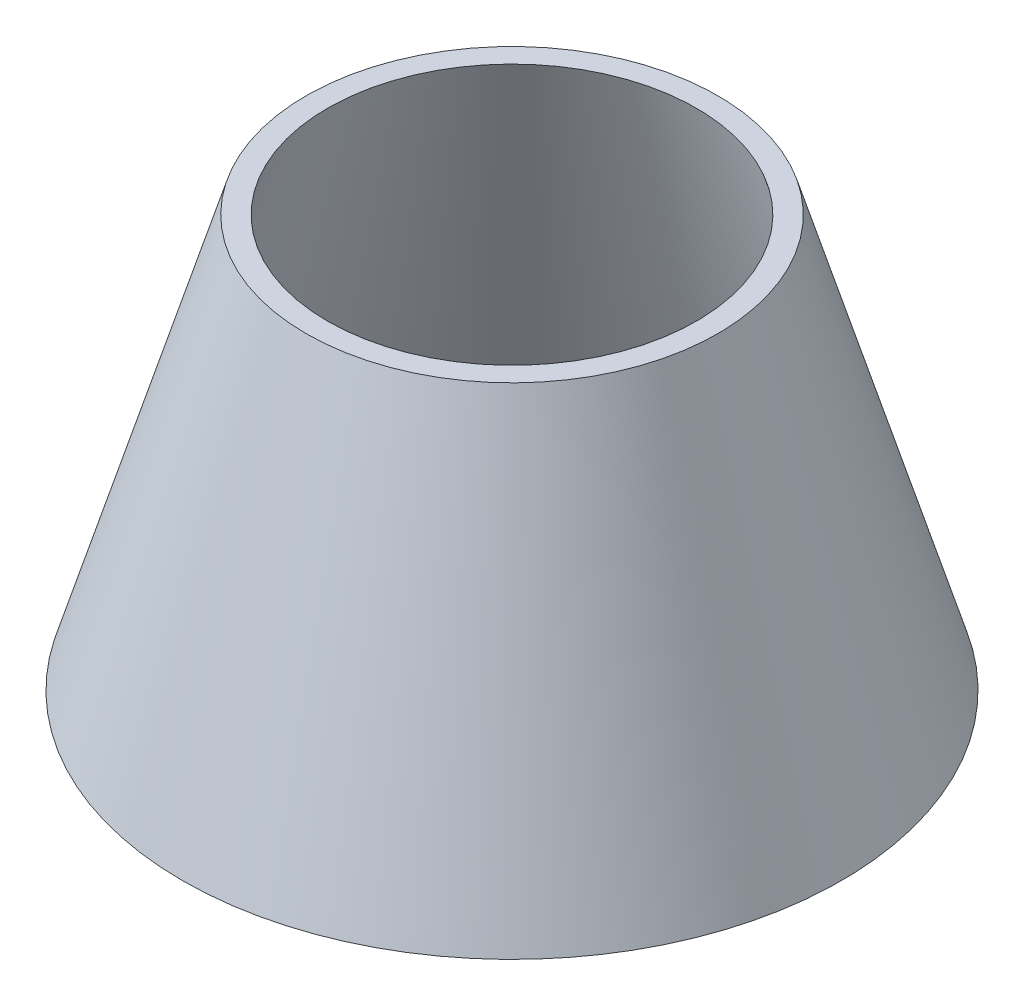
ISO-10303-21;
HEADER;
FILE_DESCRIPTION(('STEP AP214'),'2;1');
FILE_NAME('part.step','',(''),(''),'','','');
FILE_SCHEMA(('AUTOMOTIVE_DESIGN { 1 0 10303 214 1 1 1 1 }'));
ENDSEC;
DATA;
#1=APPLICATION_CONTEXT('core data for automotive mechanical design processes');
#2=APPLICATION_PROTOCOL_DEFINITION('international standard','automotive_design',2000,#1);
#3=PRODUCT_CONTEXT('',#1,'mechanical');
#4=PRODUCT('Part','Part','',(#3));
#5=PRODUCT_RELATED_PRODUCT_CATEGORY('part','',(#4));
#6=PRODUCT_DEFINITION_FORMATION('','',#4);
#7=PRODUCT_DEFINITION_CONTEXT('part definition',#1,'design');
#8=PRODUCT_DEFINITION('design','',#6,#7);
#9=PRODUCT_DEFINITION_SHAPE('','',#8);
#10=(LENGTH_UNIT() NAMED_UNIT(*) SI_UNIT(.MILLI.,.METRE.));
#11=(NAMED_UNIT(*) PLANE_ANGLE_UNIT() SI_UNIT($,.RADIAN.));
#12=(NAMED_UNIT(*) SI_UNIT($,.STERADIAN.) SOLID_ANGLE_UNIT());
#13=UNCERTAINTY_MEASURE_WITH_UNIT(LENGTH_MEASURE(1.E-05),#10,'distance_accuracy_value','');
#14=(GEOMETRIC_REPRESENTATION_CONTEXT(3) GLOBAL_UNCERTAINTY_ASSIGNED_CONTEXT((#13)) GLOBAL_UNIT_ASSIGNED_CONTEXT((#10,
#11,#12)) REPRESENTATION_CONTEXT('',''));
#15=CARTESIAN_POINT('',(0.,0.,0.));
#16=DIRECTION('',(0.,0.,1.));
#17=DIRECTION('',(1.,0.,0.));
#18=AXIS2_PLACEMENT_3D('',#15,#16,#17);
#19=CARTESIAN_POINT('',(0.,0.,0.));
#20=DIRECTION('',(0.,1.,0.));
#21=DIRECTION('',(0.,0.,1.));
#22=AXIS2_PLACEMENT_3D('',#19,#20,#21);
#23=PLANE('',#22);
#24=CARTESIAN_POINT('',(0.,0.,0.));
#25=DIRECTION('',(0.,1.,0.));
#26=DIRECTION('',(0.,0.,1.));
#27=AXIS2_PLACEMENT_3D('',#24,#25,#26);
#28=CIRCLE('',#27,47.4852026834209);
#29=CARTESIAN_POINT('',(0.,0.,47.4852026834209));
#30=VERTEX_POINT('',#29);
#31=EDGE_CURVE('E48',#30,#30,#28,.T.);
#32=ORIENTED_EDGE('',*,*,#31,.T.);
#33=EDGE_LOOP('',(#32));
#34=FACE_BOUND('',#33,.T.);
#35=CARTESIAN_POINT('',(0.,0.,0.));
#36=DIRECTION('',(0.,1.,0.));
#37=DIRECTION('',(0.,0.,1.));
#38=AXIS2_PLACEMENT_3D('',#35,#36,#37);
#39=CIRCLE('',#38,50.8);
#40=CARTESIAN_POINT('',(0.,0.,50.8));
#41=VERTEX_POINT('',#40);
#42=EDGE_CURVE('E11',#41,#41,#39,.T.);
#43=ORIENTED_EDGE('',*,*,#42,.F.);
#44=EDGE_LOOP('',(#43));
#45=FACE_BOUND('',#44,.T.);
#46=ADVANCED_FACE('F35',(#34,#45),#23,.F.);
#47=CARTESIAN_POINT('',(0.,63.5,0.));
#48=DIRECTION('',(0.,1.,0.));
#49=DIRECTION('',(0.,0.,1.));
#50=AXIS2_PLACEMENT_3D('',#47,#48,#49);
#51=PLANE('',#50);
#52=CARTESIAN_POINT('',(0.,63.5,0.));
#53=DIRECTION('',(0.,1.,0.));
#54=DIRECTION('',(0.,0.,1.));
#55=AXIS2_PLACEMENT_3D('',#52,#53,#54);
#56=CIRCLE('',#55,28.4352026834209);
#57=CARTESIAN_POINT('',(0.,63.5,28.4352026834209));
#58=VERTEX_POINT('',#57);
#59=EDGE_CURVE('E104',#58,#58,#56,.T.);
#60=ORIENTED_EDGE('',*,*,#59,.F.);
#61=EDGE_LOOP('',(#60));
#62=FACE_BOUND('',#61,.T.);
#63=CARTESIAN_POINT('',(0.,63.5,0.));
#64=DIRECTION('',(0.,1.,0.));
#65=DIRECTION('',(0.,0.,1.));
#66=AXIS2_PLACEMENT_3D('',#63,#64,#65);
#67=CIRCLE('',#66,31.75);
#68=CARTESIAN_POINT('',(0.,63.5,31.75));
#69=VERTEX_POINT('',#68);
#70=EDGE_CURVE('E43',#69,#69,#67,.T.);
#71=ORIENTED_EDGE('',*,*,#70,.T.);
#72=EDGE_LOOP('',(#71));
#73=FACE_BOUND('',#72,.T.);
#74=ADVANCED_FACE('F68',(#62,#73),#51,.T.);
#75=CARTESIAN_POINT('',(0.,63.5,0.));
#76=DIRECTION('',(0.,-1.,0.));
#77=DIRECTION('',(0.,0.,-1.));
#78=AXIS2_PLACEMENT_3D('',#75,#76,#77);
#79=CONICAL_SURFACE('',#78,31.75,0.291456794477867);
#80=ORIENTED_EDGE('',*,*,#70,.F.);
#81=EDGE_LOOP('',(#80));
#82=FACE_BOUND('',#81,.T.);
#83=ORIENTED_EDGE('',*,*,#42,.T.);
#84=EDGE_LOOP('',(#83));
#85=FACE_BOUND('',#84,.T.);
#86=ADVANCED_FACE('F77',(#82,#85),#79,.T.);
#87=CARTESIAN_POINT('',(0.,62.5876704633269,0.));
#88=DIRECTION('',(0.,-1.,0.));
#89=DIRECTION('',(0.,0.,-1.));
#90=AXIS2_PLACEMENT_3D('',#87,#88,#89);
#91=CONICAL_SURFACE('',#90,28.7089015444228,0.291456794477867);
#92=ORIENTED_EDGE('',*,*,#59,.T.);
#93=EDGE_LOOP('',(#92));
#94=FACE_BOUND('',#93,.T.);
#95=ORIENTED_EDGE('',*,*,#31,.F.);
#96=EDGE_LOOP('',(#95));
#97=FACE_BOUND('',#96,.T.);
#98=ADVANCED_FACE('F79',(#94,#97),#91,.F.);
#99=CLOSED_SHELL('',(#46,#74,#86,#98));
#100=MANIFOLD_SOLID_BREP('B2',#99);
#101=ADVANCED_BREP_SHAPE_REPRESENTATION('',(#18,#100),#14);
#102=SHAPE_DEFINITION_REPRESENTATION(#9,#101);
ENDSEC;
END-ISO-10303-21;
